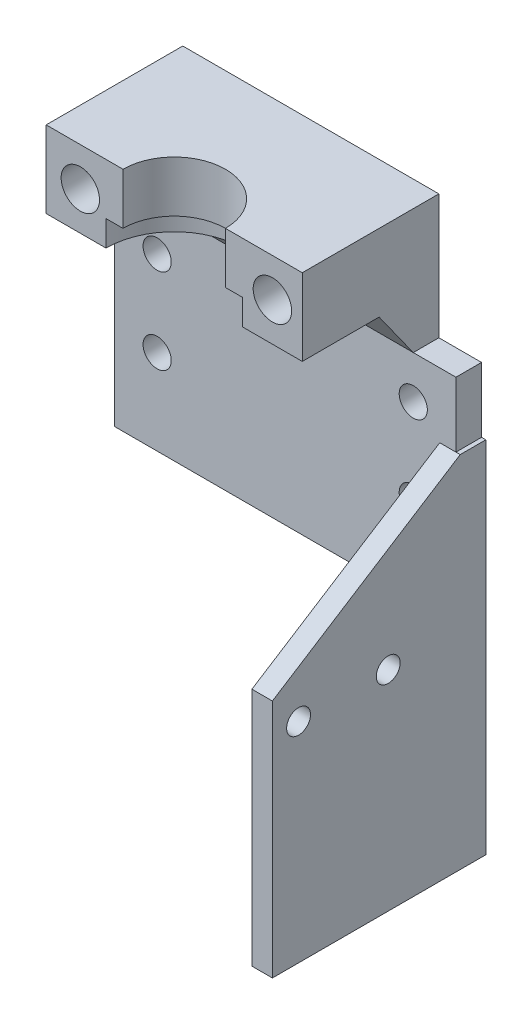
ISO-10303-21;
HEADER;
FILE_DESCRIPTION(('STEP AP214'),'2;1');
FILE_NAME('part.step','',(''),(''),'','','');
FILE_SCHEMA(('AUTOMOTIVE_DESIGN { 1 0 10303 214 1 1 1 1 }'));
ENDSEC;
DATA;
#1=APPLICATION_CONTEXT('core data for automotive mechanical design processes');
#2=APPLICATION_PROTOCOL_DEFINITION('international standard','automotive_design',2000,#1);
#3=PRODUCT_CONTEXT('',#1,'mechanical');
#4=PRODUCT('Part','Part','',(#3));
#5=PRODUCT_RELATED_PRODUCT_CATEGORY('part','',(#4));
#6=PRODUCT_DEFINITION_FORMATION('','',#4);
#7=PRODUCT_DEFINITION_CONTEXT('part definition',#1,'design');
#8=PRODUCT_DEFINITION('design','',#6,#7);
#9=PRODUCT_DEFINITION_SHAPE('','',#8);
#10=(LENGTH_UNIT() NAMED_UNIT(*) SI_UNIT(.MILLI.,.METRE.));
#11=(NAMED_UNIT(*) PLANE_ANGLE_UNIT() SI_UNIT($,.RADIAN.));
#12=(NAMED_UNIT(*) SI_UNIT($,.STERADIAN.) SOLID_ANGLE_UNIT());
#13=UNCERTAINTY_MEASURE_WITH_UNIT(LENGTH_MEASURE(1.E-05),#10,'distance_accuracy_value','');
#14=(GEOMETRIC_REPRESENTATION_CONTEXT(3) GLOBAL_UNCERTAINTY_ASSIGNED_CONTEXT((#13)) GLOBAL_UNIT_ASSIGNED_CONTEXT((#10,
#11,#12)) REPRESENTATION_CONTEXT('',''));
#15=CARTESIAN_POINT('',(0.,0.,0.));
#16=DIRECTION('',(0.,0.,1.));
#17=DIRECTION('',(1.,0.,0.));
#18=AXIS2_PLACEMENT_3D('',#15,#16,#17);
#19=CARTESIAN_POINT('',(18.1,5.90000000000003,0.));
#20=DIRECTION('',(0.,1.,0.));
#21=DIRECTION('',(-1.,0.,0.));
#22=AXIS2_PLACEMENT_3D('',#19,#20,#21);
#23=PLANE('',#22);
#24=DIRECTION('',(1.,0.,0.));
#25=VECTOR('',#24,1.);
#26=CARTESIAN_POINT('',(18.1,5.90000000000003,0.));
#27=LINE('',#26,#25);
#28=CARTESIAN_POINT('',(20.,5.90000000000003,0.));
#29=VERTEX_POINT('',#28);
#30=CARTESIAN_POINT('',(20.5,5.90000000000003,0.));
#31=VERTEX_POINT('',#30);
#32=EDGE_CURVE('E70',#29,#31,#27,.T.);
#33=ORIENTED_EDGE('',*,*,#32,.F.);
#34=DIRECTION('',(0.,0.,1.));
#35=VECTOR('',#34,1.);
#36=CARTESIAN_POINT('',(20.,5.90000000000003,0.));
#37=LINE('',#36,#35);
#38=CARTESIAN_POINT('',(20.,5.90000000000003,3.));
#39=VERTEX_POINT('',#38);
#40=EDGE_CURVE('E11',#29,#39,#37,.T.);
#41=ORIENTED_EDGE('',*,*,#40,.T.);
#42=DIRECTION('',(1.,0.,0.));
#43=VECTOR('',#42,1.);
#44=CARTESIAN_POINT('',(18.1,5.90000000000003,3.));
#45=LINE('',#44,#43);
#46=CARTESIAN_POINT('',(20.5,5.90000000000003,3.));
#47=VERTEX_POINT('',#46);
#48=EDGE_CURVE('E62',#39,#47,#45,.T.);
#49=ORIENTED_EDGE('',*,*,#48,.T.);
#50=DIRECTION('',(0.,0.,1.));
#51=VECTOR('',#50,1.);
#52=CARTESIAN_POINT('',(20.5,5.90000000000003,0.));
#53=LINE('',#52,#51);
#54=EDGE_CURVE('E217',#31,#47,#53,.T.);
#55=ORIENTED_EDGE('',*,*,#54,.F.);
#56=EDGE_LOOP('',(#33,#41,#49,#55));
#57=FACE_BOUND('',#56,.T.);
#58=ADVANCED_FACE('F47',(#57),#23,.T.);
#59=CARTESIAN_POINT('',(18.1,0.,0.));
#60=DIRECTION('',(1.,0.,0.));
#61=DIRECTION('',(0.,0.,-1.));
#62=AXIS2_PLACEMENT_3D('',#59,#60,#61);
#63=PLANE('',#62);
#64=DIRECTION('',(0.,1.,0.));
#65=VECTOR('',#64,1.);
#66=CARTESIAN_POINT('',(18.1,0.,3.));
#67=LINE('',#66,#65);
#68=CARTESIAN_POINT('',(18.1,-11.5,3.));
#69=VERTEX_POINT('',#68);
#70=CARTESIAN_POINT('',(18.1,5.90000000000003,3.));
#71=VERTEX_POINT('',#70);
#72=EDGE_CURVE('E56',#69,#71,#67,.T.);
#73=ORIENTED_EDGE('',*,*,#72,.F.);
#74=DIRECTION('',(0.,0.,1.));
#75=VECTOR('',#74,1.);
#76=CARTESIAN_POINT('',(18.1,-11.5,3.00000000000002));
#77=LINE('',#76,#75);
#78=CARTESIAN_POINT('',(18.1,-11.5,0.));
#79=VERTEX_POINT('',#78);
#80=EDGE_CURVE('E465',#79,#69,#77,.T.);
#81=ORIENTED_EDGE('',*,*,#80,.F.);
#82=DIRECTION('',(0.,-1.,0.));
#83=VECTOR('',#82,1.);
#84=CARTESIAN_POINT('',(18.1,-8.09999999999997,0.));
#85=LINE('',#84,#83);
#86=CARTESIAN_POINT('',(18.1,-36.2,0.));
#87=VERTEX_POINT('',#86);
#88=EDGE_CURVE('E249',#79,#87,#85,.T.);
#89=ORIENTED_EDGE('',*,*,#88,.T.);
#90=DIRECTION('',(0.,0.,1.));
#91=VECTOR('',#90,1.);
#92=CARTESIAN_POINT('',(18.1,-36.2,0.));
#93=LINE('',#92,#91);
#94=CARTESIAN_POINT('',(18.0999999999999,-36.2,25.));
#95=VERTEX_POINT('',#94);
#96=EDGE_CURVE('E245',#87,#95,#93,.T.);
#97=ORIENTED_EDGE('',*,*,#96,.T.);
#98=DIRECTION('',(0.,-1.,0.));
#99=VECTOR('',#98,1.);
#100=CARTESIAN_POINT('',(18.0999999999999,-8.09999999999997,25.));
#101=LINE('',#100,#99);
#102=CARTESIAN_POINT('',(18.0999999999999,-8.09999999999997,25.));
#103=VERTEX_POINT('',#102);
#104=EDGE_CURVE('E212',#103,#95,#101,.T.);
#105=ORIENTED_EDGE('',*,*,#104,.F.);
#106=DIRECTION('',(0.,-0.536875492193159,0.843661487732107));
#107=VECTOR('',#106,1.);
#108=CARTESIAN_POINT('',(18.1,5.90000000000003,3.));
#109=LINE('',#108,#107);
#110=EDGE_CURVE('E210',#71,#103,#109,.T.);
#111=ORIENTED_EDGE('',*,*,#110,.F.);
#112=EDGE_LOOP('',(#73,#81,#89,#97,#105,#111));
#113=FACE_BOUND('',#112,.T.);
#114=CARTESIAN_POINT('',(18.0999999999999,-11.7,21.9342429029104));
#115=DIRECTION('',(-1.,0.,0.));
#116=DIRECTION('',(0.,0.,1.));
#117=AXIS2_PLACEMENT_3D('',#114,#115,#116);
#118=CIRCLE('',#117,1.4);
#119=CARTESIAN_POINT('',(18.0999999999999,-11.7,23.3342429029104));
#120=VERTEX_POINT('',#119);
#121=EDGE_CURVE('E201',#120,#120,#118,.T.);
#122=ORIENTED_EDGE('',*,*,#121,.F.);
#123=EDGE_LOOP('',(#122));
#124=FACE_BOUND('',#123,.T.);
#125=CARTESIAN_POINT('',(18.0999999999999,-11.7,11.4342429029104));
#126=DIRECTION('',(-1.,0.,0.));
#127=DIRECTION('',(0.,0.,1.));
#128=AXIS2_PLACEMENT_3D('',#125,#126,#127);
#129=CIRCLE('',#128,1.4);
#130=CARTESIAN_POINT('',(18.0999999999999,-11.7,12.8342429029104));
#131=VERTEX_POINT('',#130);
#132=EDGE_CURVE('E943',#131,#131,#129,.T.);
#133=ORIENTED_EDGE('',*,*,#132,.F.);
#134=EDGE_LOOP('',(#133));
#135=FACE_BOUND('',#134,.T.);
#136=ADVANCED_FACE('F242',(#113,#124,#135),#63,.F.);
#137=CARTESIAN_POINT('',(18.1,5.90000000000003,3.));
#138=DIRECTION('',(0.,0.843661487732107,0.536875492193159));
#139=DIRECTION('',(0.,-0.536875492193159,0.843661487732107));
#140=AXIS2_PLACEMENT_3D('',#137,#138,#139);
#141=PLANE('',#140);
#142=DIRECTION('',(0.,-0.536875492193159,0.843661487732107));
#143=VECTOR('',#142,1.);
#144=CARTESIAN_POINT('',(20.5,5.90000000000003,3.));
#145=LINE('',#144,#143);
#146=CARTESIAN_POINT('',(20.4999999999999,-8.09999999999997,25.));
#147=VERTEX_POINT('',#146);
#148=EDGE_CURVE('E207',#47,#147,#145,.T.);
#149=ORIENTED_EDGE('',*,*,#148,.F.);
#150=ORIENTED_EDGE('',*,*,#48,.F.);
#151=EDGE_CURVE('E227',#71,#39,#45,.T.);
#152=ORIENTED_EDGE('',*,*,#151,.F.);
#153=ORIENTED_EDGE('',*,*,#110,.T.);
#154=DIRECTION('',(-1.,0.,0.));
#155=VECTOR('',#154,1.);
#156=CARTESIAN_POINT('',(20.4999999999999,-8.09999999999997,25.));
#157=LINE('',#156,#155);
#158=EDGE_CURVE('E193',#147,#103,#157,.T.);
#159=ORIENTED_EDGE('',*,*,#158,.F.);
#160=EDGE_LOOP('',(#149,#150,#152,#153,#159));
#161=FACE_BOUND('',#160,.T.);
#162=ADVANCED_FACE('F206',(#161),#141,.T.);
#163=CARTESIAN_POINT('',(18.1,-8.09999999999997,0.));
#164=DIRECTION('',(0.,0.,-1.));
#165=DIRECTION('',(-1.,0.,0.));
#166=AXIS2_PLACEMENT_3D('',#163,#164,#165);
#167=PLANE('',#166);
#168=DIRECTION('',(0.,1.,0.));
#169=VECTOR('',#168,1.);
#170=CARTESIAN_POINT('',(20.,-11.5,0.));
#171=LINE('',#170,#169);
#172=CARTESIAN_POINT('',(20.,13.5,0.));
#173=VERTEX_POINT('',#172);
#174=EDGE_CURVE('E391',#29,#173,#171,.T.);
#175=ORIENTED_EDGE('',*,*,#174,.F.);
#176=ORIENTED_EDGE('',*,*,#32,.T.);
#177=DIRECTION('',(0.,1.,0.));
#178=VECTOR('',#177,1.);
#179=CARTESIAN_POINT('',(20.5,-8.09999999999997,0.));
#180=LINE('',#179,#178);
#181=CARTESIAN_POINT('',(20.5,-36.2,0.));
#182=VERTEX_POINT('',#181);
#183=EDGE_CURVE('E223',#182,#31,#180,.T.);
#184=ORIENTED_EDGE('',*,*,#183,.F.);
#185=DIRECTION('',(1.,0.,0.));
#186=VECTOR('',#185,1.);
#187=CARTESIAN_POINT('',(20.5,-36.2,0.));
#188=LINE('',#187,#186);
#189=EDGE_CURVE('E254',#87,#182,#188,.T.);
#190=ORIENTED_EDGE('',*,*,#189,.F.);
#191=ORIENTED_EDGE('',*,*,#88,.F.);
#192=DIRECTION('',(1.,0.,0.));
#193=VECTOR('',#192,1.);
#194=CARTESIAN_POINT('',(-20.,-11.5,0.));
#195=LINE('',#194,#193);
#196=CARTESIAN_POINT('',(-20.,-11.5,0.));
#197=VERTEX_POINT('',#196);
#198=EDGE_CURVE('E399',#197,#79,#195,.T.);
#199=ORIENTED_EDGE('',*,*,#198,.F.);
#200=DIRECTION('',(0.,-1.,0.));
#201=VECTOR('',#200,1.);
#202=CARTESIAN_POINT('',(-20.,-11.5,0.));
#203=LINE('',#202,#201);
#204=CARTESIAN_POINT('',(-20.,13.5,0.));
#205=VERTEX_POINT('',#204);
#206=EDGE_CURVE('E417',#205,#197,#203,.T.);
#207=ORIENTED_EDGE('',*,*,#206,.F.);
#208=DIRECTION('',(-1.,0.,0.));
#209=VECTOR('',#208,1.);
#210=CARTESIAN_POINT('',(-20.,13.5,0.));
#211=LINE('',#210,#209);
#212=CARTESIAN_POINT('',(-15.,13.5,0.));
#213=VERTEX_POINT('',#212);
#214=EDGE_CURVE('E412',#213,#205,#211,.T.);
#215=ORIENTED_EDGE('',*,*,#214,.F.);
#216=DIRECTION('',(0.,-1.,0.));
#217=VECTOR('',#216,1.);
#218=CARTESIAN_POINT('',(-15.,13.5,0.));
#219=LINE('',#218,#217);
#220=CARTESIAN_POINT('',(-15.,28.1000000000001,0.));
#221=VERTEX_POINT('',#220);
#222=EDGE_CURVE('E327',#221,#213,#219,.T.);
#223=ORIENTED_EDGE('',*,*,#222,.F.);
#224=DIRECTION('',(-1.,0.,0.));
#225=VECTOR('',#224,1.);
#226=CARTESIAN_POINT('',(15.,28.1000000000001,0.));
#227=LINE('',#226,#225);
#228=CARTESIAN_POINT('',(15.,28.1000000000001,0.));
#229=VERTEX_POINT('',#228);
#230=EDGE_CURVE('E350',#229,#221,#227,.T.);
#231=ORIENTED_EDGE('',*,*,#230,.F.);
#232=DIRECTION('',(0.,-1.,0.));
#233=VECTOR('',#232,1.);
#234=CARTESIAN_POINT('',(15.,13.5,0.));
#235=LINE('',#234,#233);
#236=CARTESIAN_POINT('',(15.,13.5,0.));
#237=VERTEX_POINT('',#236);
#238=EDGE_CURVE('E345',#229,#237,#235,.T.);
#239=ORIENTED_EDGE('',*,*,#238,.T.);
#240=EDGE_CURVE('E413',#173,#237,#211,.T.);
#241=ORIENTED_EDGE('',*,*,#240,.F.);
#242=EDGE_LOOP('',(#175,#176,#184,#190,#191,#199,#207,#215,#223,#231,#239,#241));
#243=FACE_BOUND('',#242,.T.);
#244=CARTESIAN_POINT('',(-14.9999999999999,-1.5,0.));
#245=DIRECTION('',(0.,0.,1.));
#246=DIRECTION('',(1.,0.,0.));
#247=AXIS2_PLACEMENT_3D('',#244,#245,#246);
#248=CIRCLE('',#247,1.65);
#249=CARTESIAN_POINT('',(-13.3499999999999,-1.5,0.));
#250=VERTEX_POINT('',#249);
#251=EDGE_CURVE('E354',#250,#250,#248,.T.);
#252=ORIENTED_EDGE('',*,*,#251,.T.);
#253=EDGE_LOOP('',(#252));
#254=FACE_BOUND('',#253,.T.);
#255=CARTESIAN_POINT('',(15.,8.5,0.));
#256=DIRECTION('',(0.,0.,1.));
#257=DIRECTION('',(1.,0.,0.));
#258=AXIS2_PLACEMENT_3D('',#255,#256,#257);
#259=CIRCLE('',#258,1.65);
#260=CARTESIAN_POINT('',(16.65,8.5,0.));
#261=VERTEX_POINT('',#260);
#262=EDGE_CURVE('E375',#261,#261,#259,.T.);
#263=ORIENTED_EDGE('',*,*,#262,.T.);
#264=EDGE_LOOP('',(#263));
#265=FACE_BOUND('',#264,.T.);
#266=CARTESIAN_POINT('',(-15.,8.5,0.));
#267=DIRECTION('',(0.,0.,1.));
#268=DIRECTION('',(1.,0.,0.));
#269=AXIS2_PLACEMENT_3D('',#266,#267,#268);
#270=CIRCLE('',#269,1.65);
#271=CARTESIAN_POINT('',(-13.35,8.5,0.));
#272=VERTEX_POINT('',#271);
#273=EDGE_CURVE('E383',#272,#272,#270,.T.);
#274=ORIENTED_EDGE('',*,*,#273,.T.);
#275=EDGE_LOOP('',(#274));
#276=FACE_BOUND('',#275,.T.);
#277=CARTESIAN_POINT('',(15.0000000000001,-1.5,0.));
#278=DIRECTION('',(0.,0.,1.));
#279=DIRECTION('',(1.,0.,0.));
#280=AXIS2_PLACEMENT_3D('',#277,#278,#279);
#281=CIRCLE('',#280,1.65);
#282=CARTESIAN_POINT('',(16.6500000000001,-1.5,0.));
#283=VERTEX_POINT('',#282);
#284=EDGE_CURVE('E367',#283,#283,#281,.T.);
#285=ORIENTED_EDGE('',*,*,#284,.T.);
#286=EDGE_LOOP('',(#285));
#287=FACE_BOUND('',#286,.T.);
#288=CARTESIAN_POINT('',(11.5,23.6000000000001,0.));
#289=DIRECTION('',(0.,0.,1.));
#290=DIRECTION('',(1.,0.,0.));
#291=AXIS2_PLACEMENT_3D('',#288,#289,#290);
#292=CIRCLE('',#291,1.75);
#293=CARTESIAN_POINT('',(13.25,23.6000000000001,0.));
#294=VERTEX_POINT('',#293);
#295=EDGE_CURVE('E304',#294,#294,#292,.T.);
#296=ORIENTED_EDGE('',*,*,#295,.T.);
#297=EDGE_LOOP('',(#296));
#298=FACE_BOUND('',#297,.T.);
#299=CARTESIAN_POINT('',(-11.,23.6000000000001,0.));
#300=DIRECTION('',(0.,0.,1.));
#301=DIRECTION('',(1.,0.,0.));
#302=AXIS2_PLACEMENT_3D('',#299,#300,#301);
#303=CIRCLE('',#302,1.75);
#304=CARTESIAN_POINT('',(-9.25,23.6000000000001,0.));
#305=VERTEX_POINT('',#304);
#306=EDGE_CURVE('E305',#305,#305,#303,.T.);
#307=ORIENTED_EDGE('',*,*,#306,.T.);
#308=EDGE_LOOP('',(#307));
#309=FACE_BOUND('',#308,.T.);
#310=ADVANCED_FACE('F49',(#243,#254,#265,#276,#287,#298,#309),#167,.T.);
#311=CARTESIAN_POINT('',(20.5,0.,0.));
#312=DIRECTION('',(1.,0.,0.));
#313=DIRECTION('',(0.,0.,-1.));
#314=AXIS2_PLACEMENT_3D('',#311,#312,#313);
#315=PLANE('',#314);
#316=ORIENTED_EDGE('',*,*,#148,.T.);
#317=DIRECTION('',(0.,1.,0.));
#318=VECTOR('',#317,1.);
#319=CARTESIAN_POINT('',(20.4999999999999,-8.09999999999997,25.));
#320=LINE('',#319,#318);
#321=CARTESIAN_POINT('',(20.5,-36.2,25.));
#322=VERTEX_POINT('',#321);
#323=EDGE_CURVE('E189',#322,#147,#320,.T.);
#324=ORIENTED_EDGE('',*,*,#323,.F.);
#325=DIRECTION('',(0.,0.,1.));
#326=VECTOR('',#325,1.);
#327=CARTESIAN_POINT('',(20.5,-36.2,0.));
#328=LINE('',#327,#326);
#329=EDGE_CURVE('E258',#182,#322,#328,.T.);
#330=ORIENTED_EDGE('',*,*,#329,.F.);
#331=ORIENTED_EDGE('',*,*,#183,.T.);
#332=ORIENTED_EDGE('',*,*,#54,.T.);
#333=EDGE_LOOP('',(#316,#324,#330,#331,#332));
#334=FACE_BOUND('',#333,.T.);
#335=CARTESIAN_POINT('',(20.5,-11.7,21.9342429029104));
#336=DIRECTION('',(1.,0.,0.));
#337=DIRECTION('',(0.,0.,-1.));
#338=AXIS2_PLACEMENT_3D('',#335,#336,#337);
#339=CIRCLE('',#338,1.4);
#340=CARTESIAN_POINT('',(20.5,-11.7,20.5342429029104));
#341=VERTEX_POINT('',#340);
#342=EDGE_CURVE('E941',#341,#341,#339,.T.);
#343=ORIENTED_EDGE('',*,*,#342,.F.);
#344=EDGE_LOOP('',(#343));
#345=FACE_BOUND('',#344,.T.);
#346=CARTESIAN_POINT('',(20.5,-11.7,11.4342429029104));
#347=DIRECTION('',(1.,0.,0.));
#348=DIRECTION('',(0.,0.,-1.));
#349=AXIS2_PLACEMENT_3D('',#346,#347,#348);
#350=CIRCLE('',#349,1.4);
#351=CARTESIAN_POINT('',(20.5,-11.7,10.0342429029104));
#352=VERTEX_POINT('',#351);
#353=EDGE_CURVE('E944',#352,#352,#350,.T.);
#354=ORIENTED_EDGE('',*,*,#353,.F.);
#355=EDGE_LOOP('',(#354));
#356=FACE_BOUND('',#355,.T.);
#357=ADVANCED_FACE('F214',(#334,#345,#356),#315,.T.);
#358=CARTESIAN_POINT('',(11.5,23.6000000000001,0.));
#359=DIRECTION('',(0.,0.,1.));
#360=DIRECTION('',(1.,0.,0.));
#361=AXIS2_PLACEMENT_3D('',#358,#359,#360);
#362=CYLINDRICAL_SURFACE('',#361,1.75);
#363=ORIENTED_EDGE('',*,*,#295,.F.);
#364=EDGE_LOOP('',(#363));
#365=FACE_BOUND('',#364,.T.);
#366=CARTESIAN_POINT('',(11.5,23.6000000000001,10.));
#367=DIRECTION('',(0.,0.,1.));
#368=DIRECTION('',(1.,0.,0.));
#369=AXIS2_PLACEMENT_3D('',#366,#367,#368);
#370=CIRCLE('',#369,1.75);
#371=CARTESIAN_POINT('',(13.25,23.6000000000001,10.));
#372=VERTEX_POINT('',#371);
#373=EDGE_CURVE('E284',#372,#372,#370,.F.);
#374=ORIENTED_EDGE('',*,*,#373,.F.);
#375=EDGE_LOOP('',(#374));
#376=FACE_BOUND('',#375,.T.);
#377=ADVANCED_FACE('F524',(#365,#376),#362,.F.);
#378=CARTESIAN_POINT('',(-11.,23.6000000000001,0.));
#379=DIRECTION('',(0.,0.,1.));
#380=DIRECTION('',(1.,0.,0.));
#381=AXIS2_PLACEMENT_3D('',#378,#379,#380);
#382=CYLINDRICAL_SURFACE('',#381,1.75);
#383=ORIENTED_EDGE('',*,*,#306,.F.);
#384=EDGE_LOOP('',(#383));
#385=FACE_BOUND('',#384,.T.);
#386=CARTESIAN_POINT('',(-11.,23.6000000000001,10.));
#387=DIRECTION('',(0.,0.,1.));
#388=DIRECTION('',(1.,0.,0.));
#389=AXIS2_PLACEMENT_3D('',#386,#387,#388);
#390=CIRCLE('',#389,1.75);
#391=CARTESIAN_POINT('',(-9.25,23.6000000000001,10.));
#392=VERTEX_POINT('',#391);
#393=EDGE_CURVE('E268',#392,#392,#390,.F.);
#394=ORIENTED_EDGE('',*,*,#393,.F.);
#395=EDGE_LOOP('',(#394));
#396=FACE_BOUND('',#395,.T.);
#397=ADVANCED_FACE('F522',(#385,#396),#382,.F.);
#398=CARTESIAN_POINT('',(11.5,19.1000000000001,16.));
#399=DIRECTION('',(0.,0.,-1.));
#400=DIRECTION('',(-1.,0.,0.));
#401=AXIS2_PLACEMENT_3D('',#398,#399,#400);
#402=PLANE('',#401);
#403=CARTESIAN_POINT('',(-11.,23.6000000000001,16.));
#404=DIRECTION('',(0.,0.,1.));
#405=DIRECTION('',(1.,0.,0.));
#406=AXIS2_PLACEMENT_3D('',#403,#404,#405);
#407=CIRCLE('',#406,2.25);
#408=CARTESIAN_POINT('',(-8.75,23.6000000000001,16.));
#409=VERTEX_POINT('',#408);
#410=EDGE_CURVE('E269',#409,#409,#407,.T.);
#411=ORIENTED_EDGE('',*,*,#410,.F.);
#412=EDGE_LOOP('',(#411));
#413=FACE_BOUND('',#412,.T.);
#414=DIRECTION('',(1.,0.,0.));
#415=VECTOR('',#414,1.);
#416=CARTESIAN_POINT('',(15.,19.1000000000001,16.));
#417=LINE('',#416,#415);
#418=CARTESIAN_POINT('',(-15.,19.1000000000001,16.));
#419=VERTEX_POINT('',#418);
#420=CARTESIAN_POINT('',(-8.,19.1000000000001,16.));
#421=VERTEX_POINT('',#420);
#422=EDGE_CURVE('E443',#419,#421,#417,.T.);
#423=ORIENTED_EDGE('',*,*,#422,.T.);
#424=DIRECTION('',(0.,1.,0.));
#425=VECTOR('',#424,1.);
#426=CARTESIAN_POINT('',(-8.,31.8000000000001,16.));
#427=LINE('',#426,#425);
#428=CARTESIAN_POINT('',(-8.,22.1000000000001,16.));
#429=VERTEX_POINT('',#428);
#430=EDGE_CURVE('E436',#429,#421,#427,.F.);
#431=ORIENTED_EDGE('',*,*,#430,.F.);
#432=DIRECTION('',(-1.,0.,0.));
#433=VECTOR('',#432,1.);
#434=CARTESIAN_POINT('',(0.,22.1000000000001,16.));
#435=LINE('',#434,#433);
#436=CARTESIAN_POINT('',(-6.,22.1000000000001,16.));
#437=VERTEX_POINT('',#436);
#438=EDGE_CURVE('E467',#437,#429,#435,.T.);
#439=ORIENTED_EDGE('',*,*,#438,.F.);
#440=DIRECTION('',(0.,1.,0.));
#441=VECTOR('',#440,1.);
#442=CARTESIAN_POINT('',(-6.,31.8000000000001,16.));
#443=LINE('',#442,#441);
#444=CARTESIAN_POINT('',(-6.,28.1000000000001,16.));
#445=VERTEX_POINT('',#444);
#446=EDGE_CURVE('E454',#445,#437,#443,.F.);
#447=ORIENTED_EDGE('',*,*,#446,.F.);
#448=DIRECTION('',(-1.,0.,0.));
#449=VECTOR('',#448,1.);
#450=CARTESIAN_POINT('',(15.,28.1000000000001,16.));
#451=LINE('',#450,#449);
#452=CARTESIAN_POINT('',(-15.,28.1000000000001,16.));
#453=VERTEX_POINT('',#452);
#454=EDGE_CURVE('E461',#445,#453,#451,.T.);
#455=ORIENTED_EDGE('',*,*,#454,.T.);
#456=DIRECTION('',(0.,1.,0.));
#457=VECTOR('',#456,1.);
#458=CARTESIAN_POINT('',(-15.,0.,16.));
#459=LINE('',#458,#457);
#460=EDGE_CURVE('E446',#419,#453,#459,.T.);
#461=ORIENTED_EDGE('',*,*,#460,.F.);
#462=EDGE_LOOP('',(#423,#431,#439,#447,#455,#461));
#463=FACE_BOUND('',#462,.T.);
#464=ADVANCED_FACE('F481',(#413,#463),#402,.F.);
#465=CARTESIAN_POINT('',(11.5,23.6000000000001,16.));
#466=DIRECTION('',(0.,0.,1.));
#467=DIRECTION('',(1.,0.,0.));
#468=AXIS2_PLACEMENT_3D('',#465,#466,#467);
#469=CIRCLE('',#468,2.25);
#470=CARTESIAN_POINT('',(13.75,23.6000000000001,16.));
#471=VERTEX_POINT('',#470);
#472=EDGE_CURVE('E273',#471,#471,#469,.T.);
#473=ORIENTED_EDGE('',*,*,#472,.F.);
#474=EDGE_LOOP('',(#473));
#475=FACE_BOUND('',#474,.T.);
#476=CARTESIAN_POINT('',(8.,19.1000000000001,16.));
#477=VERTEX_POINT('',#476);
#478=CARTESIAN_POINT('',(15.,19.1000000000001,16.));
#479=VERTEX_POINT('',#478);
#480=EDGE_CURVE('E440',#477,#479,#417,.T.);
#481=ORIENTED_EDGE('',*,*,#480,.T.);
#482=DIRECTION('',(0.,1.,0.));
#483=VECTOR('',#482,1.);
#484=CARTESIAN_POINT('',(15.,0.,16.));
#485=LINE('',#484,#483);
#486=CARTESIAN_POINT('',(15.,28.1000000000001,16.));
#487=VERTEX_POINT('',#486);
#488=EDGE_CURVE('E447',#479,#487,#485,.T.);
#489=ORIENTED_EDGE('',*,*,#488,.T.);
#490=CARTESIAN_POINT('',(6.,28.1000000000001,16.));
#491=VERTEX_POINT('',#490);
#492=EDGE_CURVE('E451',#487,#491,#451,.T.);
#493=ORIENTED_EDGE('',*,*,#492,.T.);
#494=DIRECTION('',(0.,1.,0.));
#495=VECTOR('',#494,1.);
#496=CARTESIAN_POINT('',(6.,31.8000000000001,16.));
#497=LINE('',#496,#495);
#498=CARTESIAN_POINT('',(6.,22.1000000000001,16.));
#499=VERTEX_POINT('',#498);
#500=EDGE_CURVE('E433',#499,#491,#497,.T.);
#501=ORIENTED_EDGE('',*,*,#500,.F.);
#502=CARTESIAN_POINT('',(8.,22.1000000000001,16.));
#503=VERTEX_POINT('',#502);
#504=EDGE_CURVE('E458',#503,#499,#435,.T.);
#505=ORIENTED_EDGE('',*,*,#504,.F.);
#506=DIRECTION('',(0.,1.,0.));
#507=VECTOR('',#506,1.);
#508=CARTESIAN_POINT('',(8.,31.8000000000001,16.));
#509=LINE('',#508,#507);
#510=EDGE_CURVE('E455',#477,#503,#509,.T.);
#511=ORIENTED_EDGE('',*,*,#510,.F.);
#512=EDGE_LOOP('',(#481,#489,#493,#501,#505,#511));
#513=FACE_BOUND('',#512,.T.);
#514=ADVANCED_FACE('F489',(#475,#513),#402,.F.);
#515=CARTESIAN_POINT('',(15.,19.1000000000001,30.));
#516=DIRECTION('',(0.,-1.,0.));
#517=DIRECTION('',(0.,0.,-1.));
#518=AXIS2_PLACEMENT_3D('',#515,#516,#517);
#519=PLANE('',#518);
#520=ORIENTED_EDGE('',*,*,#422,.F.);
#521=DIRECTION('',(0.,0.,1.));
#522=VECTOR('',#521,1.);
#523=CARTESIAN_POINT('',(-15.,19.1000000000001,9.));
#524=LINE('',#523,#522);
#525=CARTESIAN_POINT('',(-15.,19.1000000000001,7.));
#526=VERTEX_POINT('',#525);
#527=EDGE_CURVE('E320',#526,#419,#524,.T.);
#528=ORIENTED_EDGE('',*,*,#527,.F.);
#529=DIRECTION('',(-1.,0.,0.));
#530=VECTOR('',#529,1.);
#531=CARTESIAN_POINT('',(15.,19.1000000000001,7.));
#532=LINE('',#531,#530);
#533=CARTESIAN_POINT('',(-7.15891053163814,19.1000000000001,7.));
#534=VERTEX_POINT('',#533);
#535=EDGE_CURVE('E359',#534,#526,#532,.T.);
#536=ORIENTED_EDGE('',*,*,#535,.F.);
#537=CARTESIAN_POINT('',(0.,19.1000000000001,16.));
#538=DIRECTION('',(0.,-1.,0.));
#539=DIRECTION('',(0.,0.,-1.));
#540=AXIS2_PLACEMENT_3D('',#537,#538,#539);
#541=CIRCLE('',#540,11.5);
#542=CARTESIAN_POINT('',(7.15891053163815,19.1000000000001,7.));
#543=VERTEX_POINT('',#542);
#544=EDGE_CURVE('E280',#543,#534,#541,.F.);
#545=ORIENTED_EDGE('',*,*,#544,.F.);
#546=CARTESIAN_POINT('',(15.,19.1000000000001,7.));
#547=VERTEX_POINT('',#546);
#548=EDGE_CURVE('E355',#547,#543,#532,.T.);
#549=ORIENTED_EDGE('',*,*,#548,.F.);
#550=DIRECTION('',(0.,0.,1.));
#551=VECTOR('',#550,1.);
#552=CARTESIAN_POINT('',(15.,19.1000000000001,9.));
#553=LINE('',#552,#551);
#554=EDGE_CURVE('E338',#547,#479,#553,.T.);
#555=ORIENTED_EDGE('',*,*,#554,.T.);
#556=ORIENTED_EDGE('',*,*,#480,.F.);
#557=CARTESIAN_POINT('',(0.,19.1000000000001,16.));
#558=DIRECTION('',(0.,1.,0.));
#559=DIRECTION('',(0.,0.,1.));
#560=AXIS2_PLACEMENT_3D('',#557,#558,#559);
#561=CIRCLE('',#560,8.);
#562=EDGE_CURVE('E300',#477,#421,#561,.T.);
#563=ORIENTED_EDGE('',*,*,#562,.T.);
#564=EDGE_LOOP('',(#520,#528,#536,#545,#549,#555,#556,#563));
#565=FACE_BOUND('',#564,.T.);
#566=ADVANCED_FACE('F505',(#565),#519,.T.);
#567=CARTESIAN_POINT('',(15.,0.,0.));
#568=DIRECTION('',(1.,0.,0.));
#569=DIRECTION('',(0.,0.,-1.));
#570=AXIS2_PLACEMENT_3D('',#567,#568,#569);
#571=PLANE('',#570);
#572=ORIENTED_EDGE('',*,*,#488,.F.);
#573=ORIENTED_EDGE('',*,*,#554,.F.);
#574=DIRECTION('',(0.,0.813733471206738,0.581238193719092));
#575=VECTOR('',#574,1.);
#576=CARTESIAN_POINT('',(15.,19.1000000000001,7.));
#577=LINE('',#576,#575);
#578=CARTESIAN_POINT('',(15.,13.5,3.));
#579=VERTEX_POINT('',#578);
#580=EDGE_CURVE('E334',#579,#547,#577,.T.);
#581=ORIENTED_EDGE('',*,*,#580,.F.);
#582=DIRECTION('',(0.,0.,1.));
#583=VECTOR('',#582,1.);
#584=CARTESIAN_POINT('',(15.,13.5,3.));
#585=LINE('',#584,#583);
#586=EDGE_CURVE('E330',#237,#579,#585,.T.);
#587=ORIENTED_EDGE('',*,*,#586,.F.);
#588=ORIENTED_EDGE('',*,*,#238,.F.);
#589=DIRECTION('',(0.,0.,-1.));
#590=VECTOR('',#589,1.);
#591=CARTESIAN_POINT('',(15.,28.1000000000001,0.));
#592=LINE('',#591,#590);
#593=EDGE_CURVE('E342',#487,#229,#592,.T.);
#594=ORIENTED_EDGE('',*,*,#593,.F.);
#595=EDGE_LOOP('',(#572,#573,#581,#587,#588,#594));
#596=FACE_BOUND('',#595,.T.);
#597=ADVANCED_FACE('F589',(#596),#571,.T.);
#598=CARTESIAN_POINT('',(-15.,0.,0.));
#599=DIRECTION('',(1.,0.,0.));
#600=DIRECTION('',(0.,0.,-1.));
#601=AXIS2_PLACEMENT_3D('',#598,#599,#600);
#602=PLANE('',#601);
#603=ORIENTED_EDGE('',*,*,#527,.T.);
#604=ORIENTED_EDGE('',*,*,#460,.T.);
#605=DIRECTION('',(0.,0.,-1.));
#606=VECTOR('',#605,1.);
#607=CARTESIAN_POINT('',(-15.,28.1000000000001,0.));
#608=LINE('',#607,#606);
#609=EDGE_CURVE('E324',#453,#221,#608,.T.);
#610=ORIENTED_EDGE('',*,*,#609,.T.);
#611=ORIENTED_EDGE('',*,*,#222,.T.);
#612=DIRECTION('',(0.,0.,1.));
#613=VECTOR('',#612,1.);
#614=CARTESIAN_POINT('',(-15.,13.5,3.));
#615=LINE('',#614,#613);
#616=CARTESIAN_POINT('',(-15.,13.5,3.));
#617=VERTEX_POINT('',#616);
#618=EDGE_CURVE('E309',#213,#617,#615,.T.);
#619=ORIENTED_EDGE('',*,*,#618,.T.);
#620=DIRECTION('',(0.,0.813733471206738,0.581238193719092));
#621=VECTOR('',#620,1.);
#622=CARTESIAN_POINT('',(-15.,19.1000000000001,7.));
#623=LINE('',#622,#621);
#624=EDGE_CURVE('E316',#617,#526,#623,.T.);
#625=ORIENTED_EDGE('',*,*,#624,.T.);
#626=EDGE_LOOP('',(#603,#604,#610,#611,#619,#625));
#627=FACE_BOUND('',#626,.T.);
#628=ADVANCED_FACE('F500',(#627),#602,.F.);
#629=CARTESIAN_POINT('',(-20.,13.5,3.));
#630=DIRECTION('',(0.,-1.,0.));
#631=DIRECTION('',(0.,0.,-1.));
#632=AXIS2_PLACEMENT_3D('',#629,#630,#631);
#633=PLANE('',#632);
#634=ORIENTED_EDGE('',*,*,#618,.F.);
#635=ORIENTED_EDGE('',*,*,#214,.T.);
#636=DIRECTION('',(0.,0.,-1.));
#637=VECTOR('',#636,1.);
#638=CARTESIAN_POINT('',(-20.,13.5,3.));
#639=LINE('',#638,#637);
#640=CARTESIAN_POINT('',(-20.,13.5,3.));
#641=VERTEX_POINT('',#640);
#642=EDGE_CURVE('E425',#641,#205,#639,.T.);
#643=ORIENTED_EDGE('',*,*,#642,.F.);
#644=DIRECTION('',(-1.,0.,0.));
#645=VECTOR('',#644,1.);
#646=CARTESIAN_POINT('',(-20.,13.5,3.));
#647=LINE('',#646,#645);
#648=EDGE_CURVE('E398',#617,#641,#647,.T.);
#649=ORIENTED_EDGE('',*,*,#648,.F.);
#650=EDGE_LOOP('',(#634,#635,#643,#649));
#651=FACE_BOUND('',#650,.T.);
#652=ADVANCED_FACE('F557',(#651),#633,.F.);
#653=CARTESIAN_POINT('',(0.,0.,3.));
#654=DIRECTION('',(0.,0.,-1.));
#655=DIRECTION('',(-1.,0.,0.));
#656=AXIS2_PLACEMENT_3D('',#653,#654,#655);
#657=PLANE('',#656);
#658=ORIENTED_EDGE('',*,*,#151,.T.);
#659=DIRECTION('',(0.,1.,0.));
#660=VECTOR('',#659,1.);
#661=CARTESIAN_POINT('',(20.,-11.5,3.));
#662=LINE('',#661,#660);
#663=CARTESIAN_POINT('',(20.,13.5,3.));
#664=VERTEX_POINT('',#663);
#665=EDGE_CURVE('E395',#39,#664,#662,.T.);
#666=ORIENTED_EDGE('',*,*,#665,.T.);
#667=EDGE_CURVE('E400',#664,#579,#647,.T.);
#668=ORIENTED_EDGE('',*,*,#667,.T.);
#669=DIRECTION('',(-1.,0.,0.));
#670=VECTOR('',#669,1.);
#671=CARTESIAN_POINT('',(15.,13.5,3.));
#672=LINE('',#671,#670);
#673=EDGE_CURVE('E349',#579,#617,#672,.T.);
#674=ORIENTED_EDGE('',*,*,#673,.T.);
#675=ORIENTED_EDGE('',*,*,#648,.T.);
#676=DIRECTION('',(0.,-1.,0.));
#677=VECTOR('',#676,1.);
#678=CARTESIAN_POINT('',(-20.,-11.5,3.));
#679=LINE('',#678,#677);
#680=CARTESIAN_POINT('',(-20.,-11.5,3.));
#681=VERTEX_POINT('',#680);
#682=EDGE_CURVE('E404',#641,#681,#679,.T.);
#683=ORIENTED_EDGE('',*,*,#682,.T.);
#684=DIRECTION('',(1.,0.,0.));
#685=VECTOR('',#684,1.);
#686=CARTESIAN_POINT('',(-20.,-11.5,3.));
#687=LINE('',#686,#685);
#688=EDGE_CURVE('E238',#681,#69,#687,.T.);
#689=ORIENTED_EDGE('',*,*,#688,.T.);
#690=ORIENTED_EDGE('',*,*,#72,.T.);
#691=EDGE_LOOP('',(#658,#666,#668,#674,#675,#683,#689,#690));
#692=FACE_BOUND('',#691,.T.);
#693=CARTESIAN_POINT('',(-15.,8.5,3.));
#694=DIRECTION('',(0.,0.,1.));
#695=DIRECTION('',(1.,0.,0.));
#696=AXIS2_PLACEMENT_3D('',#693,#694,#695);
#697=CIRCLE('',#696,1.65);
#698=CARTESIAN_POINT('',(-13.35,8.5,3.));
#699=VERTEX_POINT('',#698);
#700=EDGE_CURVE('E387',#699,#699,#697,.T.);
#701=ORIENTED_EDGE('',*,*,#700,.F.);
#702=EDGE_LOOP('',(#701));
#703=FACE_BOUND('',#702,.T.);
#704=CARTESIAN_POINT('',(15.,8.5,3.));
#705=DIRECTION('',(0.,0.,1.));
#706=DIRECTION('',(1.,0.,0.));
#707=AXIS2_PLACEMENT_3D('',#704,#705,#706);
#708=CIRCLE('',#707,1.65);
#709=CARTESIAN_POINT('',(16.65,8.5,3.));
#710=VERTEX_POINT('',#709);
#711=EDGE_CURVE('E379',#710,#710,#708,.T.);
#712=ORIENTED_EDGE('',*,*,#711,.F.);
#713=EDGE_LOOP('',(#712));
#714=FACE_BOUND('',#713,.T.);
#715=CARTESIAN_POINT('',(15.0000000000001,-1.5,3.));
#716=DIRECTION('',(0.,0.,1.));
#717=DIRECTION('',(1.,0.,0.));
#718=AXIS2_PLACEMENT_3D('',#715,#716,#717);
#719=CIRCLE('',#718,1.65);
#720=CARTESIAN_POINT('',(16.6500000000001,-1.5,3.));
#721=VERTEX_POINT('',#720);
#722=EDGE_CURVE('E371',#721,#721,#719,.T.);
#723=ORIENTED_EDGE('',*,*,#722,.F.);
#724=EDGE_LOOP('',(#723));
#725=FACE_BOUND('',#724,.T.);
#726=CARTESIAN_POINT('',(-14.9999999999999,-1.5,3.));
#727=DIRECTION('',(0.,0.,1.));
#728=DIRECTION('',(1.,0.,0.));
#729=AXIS2_PLACEMENT_3D('',#726,#727,#728);
#730=CIRCLE('',#729,1.65);
#731=CARTESIAN_POINT('',(-13.3499999999999,-1.5,3.));
#732=VERTEX_POINT('',#731);
#733=EDGE_CURVE('E363',#732,#732,#730,.T.);
#734=ORIENTED_EDGE('',*,*,#733,.F.);
#735=EDGE_LOOP('',(#734));
#736=FACE_BOUND('',#735,.T.);
#737=ADVANCED_FACE('F234',(#692,#703,#714,#725,#736),#657,.F.);
#738=CARTESIAN_POINT('',(20.,-11.5,3.));
#739=DIRECTION('',(-1.,0.,0.));
#740=DIRECTION('',(0.,0.,1.));
#741=AXIS2_PLACEMENT_3D('',#738,#739,#740);
#742=PLANE('',#741);
#743=ORIENTED_EDGE('',*,*,#40,.F.);
#744=ORIENTED_EDGE('',*,*,#174,.T.);
#745=DIRECTION('',(0.,0.,-1.));
#746=VECTOR('',#745,1.);
#747=CARTESIAN_POINT('',(20.,13.5,3.));
#748=LINE('',#747,#746);
#749=EDGE_CURVE('E429',#664,#173,#748,.T.);
#750=ORIENTED_EDGE('',*,*,#749,.F.);
#751=ORIENTED_EDGE('',*,*,#665,.F.);
#752=EDGE_LOOP('',(#743,#744,#750,#751));
#753=FACE_BOUND('',#752,.T.);
#754=ADVANCED_FACE('F548',(#753),#742,.F.);
#755=ORIENTED_EDGE('',*,*,#240,.T.);
#756=ORIENTED_EDGE('',*,*,#586,.T.);
#757=ORIENTED_EDGE('',*,*,#667,.F.);
#758=ORIENTED_EDGE('',*,*,#749,.T.);
#759=EDGE_LOOP('',(#755,#756,#757,#758));
#760=FACE_BOUND('',#759,.T.);
#761=ADVANCED_FACE('F551',(#760),#633,.F.);
#762=CARTESIAN_POINT('',(-20.,-11.5,3.));
#763=DIRECTION('',(1.,0.,0.));
#764=DIRECTION('',(0.,0.,-1.));
#765=AXIS2_PLACEMENT_3D('',#762,#763,#764);
#766=PLANE('',#765);
#767=ORIENTED_EDGE('',*,*,#206,.T.);
#768=DIRECTION('',(0.,0.,-1.));
#769=VECTOR('',#768,1.);
#770=CARTESIAN_POINT('',(-20.,-11.5,3.));
#771=LINE('',#770,#769);
#772=EDGE_CURVE('E409',#681,#197,#771,.T.);
#773=ORIENTED_EDGE('',*,*,#772,.F.);
#774=ORIENTED_EDGE('',*,*,#682,.F.);
#775=ORIENTED_EDGE('',*,*,#642,.T.);
#776=EDGE_LOOP('',(#767,#773,#774,#775));
#777=FACE_BOUND('',#776,.T.);
#778=ADVANCED_FACE('F555',(#777),#766,.F.);
#779=CARTESIAN_POINT('',(-20.,-11.5,3.));
#780=DIRECTION('',(0.,1.,0.));
#781=DIRECTION('',(0.,0.,1.));
#782=AXIS2_PLACEMENT_3D('',#779,#780,#781);
#783=PLANE('',#782);
#784=ORIENTED_EDGE('',*,*,#198,.T.);
#785=ORIENTED_EDGE('',*,*,#80,.T.);
#786=ORIENTED_EDGE('',*,*,#688,.F.);
#787=ORIENTED_EDGE('',*,*,#772,.T.);
#788=EDGE_LOOP('',(#784,#785,#786,#787));
#789=FACE_BOUND('',#788,.T.);
#790=ADVANCED_FACE('F560',(#789),#783,.F.);
#791=CARTESIAN_POINT('',(-15.,8.5,3.));
#792=DIRECTION('',(0.,0.,-1.));
#793=DIRECTION('',(-1.,0.,0.));
#794=AXIS2_PLACEMENT_3D('',#791,#792,#793);
#795=CYLINDRICAL_SURFACE('',#794,1.65);
#796=ORIENTED_EDGE('',*,*,#700,.T.);
#797=EDGE_LOOP('',(#796));
#798=FACE_BOUND('',#797,.T.);
#799=ORIENTED_EDGE('',*,*,#273,.F.);
#800=EDGE_LOOP('',(#799));
#801=FACE_BOUND('',#800,.T.);
#802=ADVANCED_FACE('F564',(#798,#801),#795,.F.);
#803=CARTESIAN_POINT('',(15.,8.5,3.));
#804=DIRECTION('',(0.,0.,-1.));
#805=DIRECTION('',(-1.,0.,0.));
#806=AXIS2_PLACEMENT_3D('',#803,#804,#805);
#807=CYLINDRICAL_SURFACE('',#806,1.65);
#808=ORIENTED_EDGE('',*,*,#711,.T.);
#809=EDGE_LOOP('',(#808));
#810=FACE_BOUND('',#809,.T.);
#811=ORIENTED_EDGE('',*,*,#262,.F.);
#812=EDGE_LOOP('',(#811));
#813=FACE_BOUND('',#812,.T.);
#814=ADVANCED_FACE('F570',(#810,#813),#807,.F.);
#815=CARTESIAN_POINT('',(15.0000000000001,-1.5,3.));
#816=DIRECTION('',(0.,0.,-1.));
#817=DIRECTION('',(-1.,0.,0.));
#818=AXIS2_PLACEMENT_3D('',#815,#816,#817);
#819=CYLINDRICAL_SURFACE('',#818,1.65);
#820=ORIENTED_EDGE('',*,*,#722,.T.);
#821=EDGE_LOOP('',(#820));
#822=FACE_BOUND('',#821,.T.);
#823=ORIENTED_EDGE('',*,*,#284,.F.);
#824=EDGE_LOOP('',(#823));
#825=FACE_BOUND('',#824,.T.);
#826=ADVANCED_FACE('F574',(#822,#825),#819,.F.);
#827=CARTESIAN_POINT('',(-14.9999999999999,-1.5,3.));
#828=DIRECTION('',(0.,0.,-1.));
#829=DIRECTION('',(-1.,0.,0.));
#830=AXIS2_PLACEMENT_3D('',#827,#828,#829);
#831=CYLINDRICAL_SURFACE('',#830,1.65);
#832=ORIENTED_EDGE('',*,*,#733,.T.);
#833=EDGE_LOOP('',(#832));
#834=FACE_BOUND('',#833,.T.);
#835=ORIENTED_EDGE('',*,*,#251,.F.);
#836=EDGE_LOOP('',(#835));
#837=FACE_BOUND('',#836,.T.);
#838=ADVANCED_FACE('F578',(#834,#837),#831,.F.);
#839=CARTESIAN_POINT('',(15.,28.1000000000001,0.));
#840=DIRECTION('',(0.,1.,0.));
#841=DIRECTION('',(0.,0.,1.));
#842=AXIS2_PLACEMENT_3D('',#839,#840,#841);
#843=PLANE('',#842);
#844=ORIENTED_EDGE('',*,*,#492,.F.);
#845=ORIENTED_EDGE('',*,*,#593,.T.);
#846=ORIENTED_EDGE('',*,*,#230,.T.);
#847=ORIENTED_EDGE('',*,*,#609,.F.);
#848=ORIENTED_EDGE('',*,*,#454,.F.);
#849=CARTESIAN_POINT('',(0.,28.1000000000001,16.));
#850=DIRECTION('',(0.,1.,0.));
#851=DIRECTION('',(0.,0.,1.));
#852=AXIS2_PLACEMENT_3D('',#849,#850,#851);
#853=CIRCLE('',#852,6.);
#854=EDGE_CURVE('E288',#491,#445,#853,.T.);
#855=ORIENTED_EDGE('',*,*,#854,.F.);
#856=EDGE_LOOP('',(#844,#845,#846,#847,#848,#855));
#857=FACE_BOUND('',#856,.T.);
#858=ADVANCED_FACE('F496',(#857),#843,.T.);
#859=CARTESIAN_POINT('',(15.,19.1000000000001,7.));
#860=DIRECTION('',(0.,-0.581238193719092,0.813733471206738));
#861=DIRECTION('',(0.,-0.813733471206738,-0.581238193719092));
#862=AXIS2_PLACEMENT_3D('',#859,#860,#861);
#863=PLANE('',#862);
#864=CARTESIAN_POINT('',(0.,31.7000000000002,16.));
#865=DIRECTION('',(0.,-0.581238193719092,0.813733471206738));
#866=DIRECTION('',(0.,-0.813733471206738,-0.581238193719092));
#867=AXIS2_PLACEMENT_3D('',#864,#865,#866);
#868=ELLIPSE('',#867,19.7853481141982,11.5);
#869=EDGE_CURVE('E283',#534,#543,#868,.T.);
#870=ORIENTED_EDGE('',*,*,#869,.F.);
#871=ORIENTED_EDGE('',*,*,#535,.T.);
#872=ORIENTED_EDGE('',*,*,#624,.F.);
#873=ORIENTED_EDGE('',*,*,#673,.F.);
#874=ORIENTED_EDGE('',*,*,#580,.T.);
#875=ORIENTED_EDGE('',*,*,#548,.T.);
#876=EDGE_LOOP('',(#870,#871,#872,#873,#874,#875));
#877=FACE_BOUND('',#876,.T.);
#878=ADVANCED_FACE('F583',(#877),#863,.T.);
#879=CARTESIAN_POINT('',(0.,31.8000000000001,16.));
#880=DIRECTION('',(0.,1.,0.));
#881=DIRECTION('',(0.,0.,1.));
#882=AXIS2_PLACEMENT_3D('',#879,#880,#881);
#883=CYLINDRICAL_SURFACE('',#882,8.);
#884=CARTESIAN_POINT('',(0.,22.1000000000001,16.));
#885=DIRECTION('',(0.,1.,0.));
#886=DIRECTION('',(0.,0.,1.));
#887=AXIS2_PLACEMENT_3D('',#884,#885,#886);
#888=CIRCLE('',#887,8.);
#889=EDGE_CURVE('E296',#503,#429,#888,.T.);
#890=ORIENTED_EDGE('',*,*,#889,.T.);
#891=ORIENTED_EDGE('',*,*,#430,.T.);
#892=ORIENTED_EDGE('',*,*,#562,.F.);
#893=ORIENTED_EDGE('',*,*,#510,.T.);
#894=EDGE_LOOP('',(#890,#891,#892,#893));
#895=FACE_BOUND('',#894,.T.);
#896=ADVANCED_FACE('F486',(#895),#883,.F.);
#897=CARTESIAN_POINT('',(0.,22.1000000000001,8.));
#898=DIRECTION('',(0.,1.,0.));
#899=DIRECTION('',(0.,0.,1.));
#900=AXIS2_PLACEMENT_3D('',#897,#898,#899);
#901=PLANE('',#900);
#902=ORIENTED_EDGE('',*,*,#889,.F.);
#903=ORIENTED_EDGE('',*,*,#504,.T.);
#904=CARTESIAN_POINT('',(0.,22.1000000000001,16.));
#905=DIRECTION('',(0.,1.,0.));
#906=DIRECTION('',(0.,0.,1.));
#907=AXIS2_PLACEMENT_3D('',#904,#905,#906);
#908=CIRCLE('',#907,6.);
#909=EDGE_CURVE('E292',#499,#437,#908,.T.);
#910=ORIENTED_EDGE('',*,*,#909,.T.);
#911=ORIENTED_EDGE('',*,*,#438,.T.);
#912=EDGE_LOOP('',(#902,#903,#910,#911));
#913=FACE_BOUND('',#912,.T.);
#914=ADVANCED_FACE('F476',(#913),#901,.F.);
#915=CARTESIAN_POINT('',(0.,31.8000000000001,16.));
#916=DIRECTION('',(0.,1.,0.));
#917=DIRECTION('',(0.,0.,1.));
#918=AXIS2_PLACEMENT_3D('',#915,#916,#917);
#919=CYLINDRICAL_SURFACE('',#918,6.);
#920=ORIENTED_EDGE('',*,*,#854,.T.);
#921=ORIENTED_EDGE('',*,*,#446,.T.);
#922=ORIENTED_EDGE('',*,*,#909,.F.);
#923=ORIENTED_EDGE('',*,*,#500,.T.);
#924=EDGE_LOOP('',(#920,#921,#922,#923));
#925=FACE_BOUND('',#924,.T.);
#926=ADVANCED_FACE('F493',(#925),#919,.F.);
#927=CARTESIAN_POINT('',(0.,51.6269119345812,16.));
#928=DIRECTION('',(0.,-1.,0.));
#929=DIRECTION('',(0.,0.,-1.));
#930=AXIS2_PLACEMENT_3D('',#927,#928,#929);
#931=CYLINDRICAL_SURFACE('',#930,11.5);
#932=ORIENTED_EDGE('',*,*,#869,.T.);
#933=ORIENTED_EDGE('',*,*,#544,.T.);
#934=EDGE_LOOP('',(#932,#933));
#935=FACE_BOUND('',#934,.T.);
#936=ADVANCED_FACE('F547',(#935),#931,.F.);
#937=CARTESIAN_POINT('',(-11.,23.6000000000001,10.));
#938=DIRECTION('',(0.,0.,1.));
#939=DIRECTION('',(1.,0.,0.));
#940=AXIS2_PLACEMENT_3D('',#937,#938,#939);
#941=PLANE('',#940);
#942=CARTESIAN_POINT('',(-11.,23.6000000000001,10.));
#943=DIRECTION('',(0.,0.,1.));
#944=DIRECTION('',(1.,0.,0.));
#945=AXIS2_PLACEMENT_3D('',#942,#943,#944);
#946=CIRCLE('',#945,2.25);
#947=CARTESIAN_POINT('',(-8.75,23.6000000000001,10.));
#948=VERTEX_POINT('',#947);
#949=EDGE_CURVE('E264',#948,#948,#946,.T.);
#950=ORIENTED_EDGE('',*,*,#949,.T.);
#951=EDGE_LOOP('',(#950));
#952=FACE_BOUND('',#951,.T.);
#953=ORIENTED_EDGE('',*,*,#393,.T.);
#954=EDGE_LOOP('',(#953));
#955=FACE_BOUND('',#954,.T.);
#956=ADVANCED_FACE('F520',(#952,#955),#941,.T.);
#957=CARTESIAN_POINT('',(-11.,23.6000000000001,10.));
#958=DIRECTION('',(0.,0.,1.));
#959=DIRECTION('',(1.,0.,0.));
#960=AXIS2_PLACEMENT_3D('',#957,#958,#959);
#961=CYLINDRICAL_SURFACE('',#960,2.25);
#962=ORIENTED_EDGE('',*,*,#949,.F.);
#963=EDGE_LOOP('',(#962));
#964=FACE_BOUND('',#963,.T.);
#965=ORIENTED_EDGE('',*,*,#410,.T.);
#966=EDGE_LOOP('',(#965));
#967=FACE_BOUND('',#966,.T.);
#968=ADVANCED_FACE('F638',(#964,#967),#961,.F.);
#969=CARTESIAN_POINT('',(11.5,23.6000000000001,10.));
#970=DIRECTION('',(0.,0.,1.));
#971=DIRECTION('',(1.,0.,0.));
#972=AXIS2_PLACEMENT_3D('',#969,#970,#971);
#973=PLANE('',#972);
#974=CARTESIAN_POINT('',(11.5,23.6000000000001,10.));
#975=DIRECTION('',(0.,0.,1.));
#976=DIRECTION('',(1.,0.,0.));
#977=AXIS2_PLACEMENT_3D('',#974,#975,#976);
#978=CIRCLE('',#977,2.25);
#979=CARTESIAN_POINT('',(13.75,23.6000000000001,10.));
#980=VERTEX_POINT('',#979);
#981=EDGE_CURVE('E261',#980,#980,#978,.T.);
#982=ORIENTED_EDGE('',*,*,#981,.T.);
#983=EDGE_LOOP('',(#982));
#984=FACE_BOUND('',#983,.T.);
#985=ORIENTED_EDGE('',*,*,#373,.T.);
#986=EDGE_LOOP('',(#985));
#987=FACE_BOUND('',#986,.T.);
#988=ADVANCED_FACE('F631',(#984,#987),#973,.T.);
#989=CARTESIAN_POINT('',(11.5,23.6000000000001,10.));
#990=DIRECTION('',(0.,0.,1.));
#991=DIRECTION('',(1.,0.,0.));
#992=AXIS2_PLACEMENT_3D('',#989,#990,#991);
#993=CYLINDRICAL_SURFACE('',#992,2.25);
#994=ORIENTED_EDGE('',*,*,#981,.F.);
#995=EDGE_LOOP('',(#994));
#996=FACE_BOUND('',#995,.T.);
#997=ORIENTED_EDGE('',*,*,#472,.T.);
#998=EDGE_LOOP('',(#997));
#999=FACE_BOUND('',#998,.T.);
#1000=ADVANCED_FACE('F624',(#996,#999),#993,.F.);
#1001=CARTESIAN_POINT('',(20.5,-36.2,0.));
#1002=DIRECTION('',(0.,-1.,0.));
#1003=DIRECTION('',(0.,0.,-1.));
#1004=AXIS2_PLACEMENT_3D('',#1001,#1002,#1003);
#1005=PLANE('',#1004);
#1006=ORIENTED_EDGE('',*,*,#329,.T.);
#1007=DIRECTION('',(1.,0.,0.));
#1008=VECTOR('',#1007,1.);
#1009=CARTESIAN_POINT('',(20.5,-36.2,25.));
#1010=LINE('',#1009,#1008);
#1011=EDGE_CURVE('E196',#95,#322,#1010,.T.);
#1012=ORIENTED_EDGE('',*,*,#1011,.F.);
#1013=ORIENTED_EDGE('',*,*,#96,.F.);
#1014=ORIENTED_EDGE('',*,*,#189,.T.);
#1015=EDGE_LOOP('',(#1006,#1012,#1013,#1014));
#1016=FACE_BOUND('',#1015,.T.);
#1017=ADVANCED_FACE('F622',(#1016),#1005,.T.);
#1018=CARTESIAN_POINT('',(0.,0.,25.));
#1019=DIRECTION('',(0.,0.,-1.));
#1020=DIRECTION('',(-1.,0.,0.));
#1021=AXIS2_PLACEMENT_3D('',#1018,#1019,#1020);
#1022=PLANE('',#1021);
#1023=ORIENTED_EDGE('',*,*,#323,.T.);
#1024=ORIENTED_EDGE('',*,*,#158,.T.);
#1025=ORIENTED_EDGE('',*,*,#104,.T.);
#1026=ORIENTED_EDGE('',*,*,#1011,.T.);
#1027=EDGE_LOOP('',(#1023,#1024,#1025,#1026));
#1028=FACE_BOUND('',#1027,.T.);
#1029=ADVANCED_FACE('F191',(#1028),#1022,.F.);
#1030=CARTESIAN_POINT('',(-10.5,-11.7,11.4342429029104));
#1031=DIRECTION('',(1.,0.,0.));
#1032=DIRECTION('',(0.,0.,-1.));
#1033=AXIS2_PLACEMENT_3D('',#1030,#1031,#1032);
#1034=CYLINDRICAL_SURFACE('',#1033,1.4);
#1035=ORIENTED_EDGE('',*,*,#132,.T.);
#1036=EDGE_LOOP('',(#1035));
#1037=FACE_BOUND('',#1036,.T.);
#1038=ORIENTED_EDGE('',*,*,#353,.T.);
#1039=EDGE_LOOP('',(#1038));
#1040=FACE_BOUND('',#1039,.T.);
#1041=ADVANCED_FACE('F629',(#1037,#1040),#1034,.F.);
#1042=CARTESIAN_POINT('',(-10.5,-11.7,21.9342429029104));
#1043=DIRECTION('',(1.,0.,0.));
#1044=DIRECTION('',(0.,0.,-1.));
#1045=AXIS2_PLACEMENT_3D('',#1042,#1043,#1044);
#1046=CYLINDRICAL_SURFACE('',#1045,1.4);
#1047=ORIENTED_EDGE('',*,*,#121,.T.);
#1048=EDGE_LOOP('',(#1047));
#1049=FACE_BOUND('',#1048,.T.);
#1050=ORIENTED_EDGE('',*,*,#342,.T.);
#1051=EDGE_LOOP('',(#1050));
#1052=FACE_BOUND('',#1051,.T.);
#1053=ADVANCED_FACE('F693',(#1049,#1052),#1046,.F.);
#1054=CLOSED_SHELL('',(#58,#136,#162,#310,#357,#377,#397,#464,#514,#566,#597,#628,#652,#737,
#754,#761,#778,#790,#802,#814,#826,#838,#858,#878,#896,#914,#926,#936,#956,#968,#988,#1000,
#1017,#1029,#1041,#1053));
#1055=MANIFOLD_SOLID_BREP('B2',#1054);
#1056=ADVANCED_BREP_SHAPE_REPRESENTATION('',(#18,#1055),#14);
#1057=SHAPE_DEFINITION_REPRESENTATION(#9,#1056);
ENDSEC;
END-ISO-10303-21;
